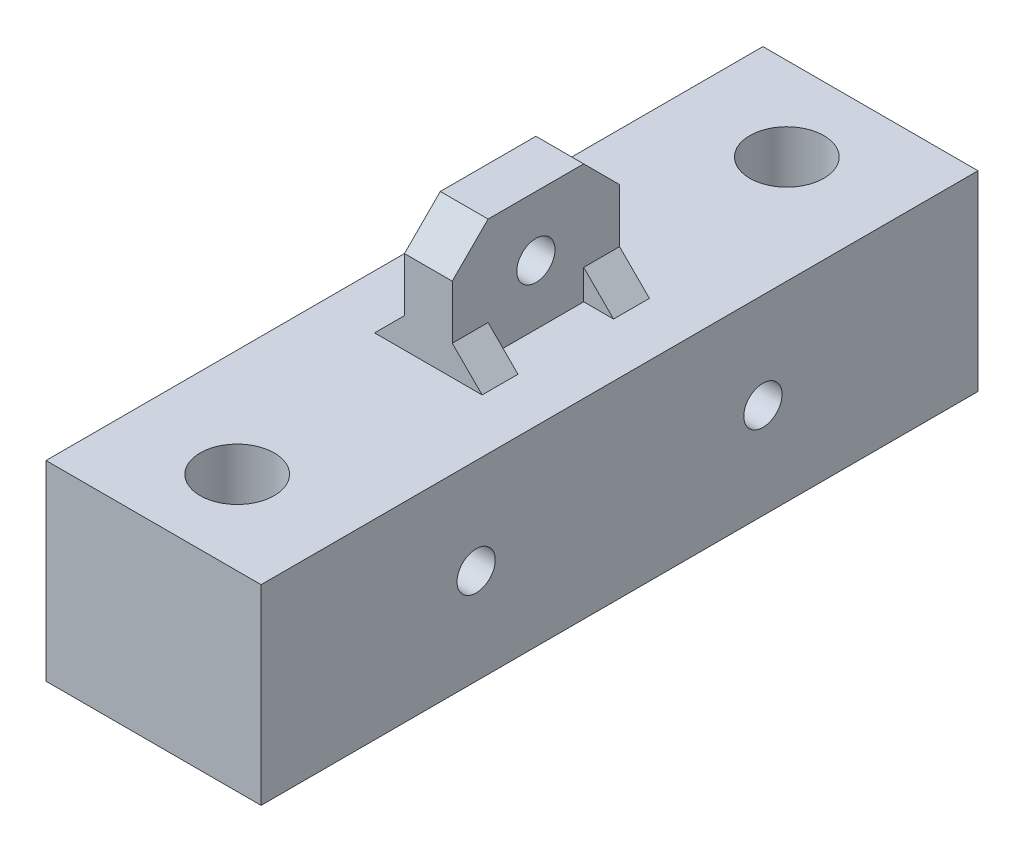
ISO-10303-21;
HEADER;
FILE_DESCRIPTION(('STEP AP214'),'2;1');
FILE_NAME('part.step','',(''),(''),'','','');
FILE_SCHEMA(('AUTOMOTIVE_DESIGN { 1 0 10303 214 1 1 1 1 }'));
ENDSEC;
DATA;
#1=APPLICATION_CONTEXT('core data for automotive mechanical design processes');
#2=APPLICATION_PROTOCOL_DEFINITION('international standard','automotive_design',2000,#1);
#3=PRODUCT_CONTEXT('',#1,'mechanical');
#4=PRODUCT('Part','Part','',(#3));
#5=PRODUCT_RELATED_PRODUCT_CATEGORY('part','',(#4));
#6=PRODUCT_DEFINITION_FORMATION('','',#4);
#7=PRODUCT_DEFINITION_CONTEXT('part definition',#1,'design');
#8=PRODUCT_DEFINITION('design','',#6,#7);
#9=PRODUCT_DEFINITION_SHAPE('','',#8);
#10=(LENGTH_UNIT() NAMED_UNIT(*) SI_UNIT(.MILLI.,.METRE.));
#11=(NAMED_UNIT(*) PLANE_ANGLE_UNIT() SI_UNIT($,.RADIAN.));
#12=(NAMED_UNIT(*) SI_UNIT($,.STERADIAN.) SOLID_ANGLE_UNIT());
#13=UNCERTAINTY_MEASURE_WITH_UNIT(LENGTH_MEASURE(1.E-05),#10,'distance_accuracy_value','');
#14=(GEOMETRIC_REPRESENTATION_CONTEXT(3) GLOBAL_UNCERTAINTY_ASSIGNED_CONTEXT((#13)) GLOBAL_UNIT_ASSIGNED_CONTEXT((#10,
#11,#12)) REPRESENTATION_CONTEXT('',''));
#15=CARTESIAN_POINT('',(0.,0.,0.));
#16=DIRECTION('',(0.,0.,1.));
#17=DIRECTION('',(1.,0.,0.));
#18=AXIS2_PLACEMENT_3D('',#15,#16,#17);
#19=CARTESIAN_POINT('',(0.,16.,0.));
#20=DIRECTION('',(0.,-1.,0.));
#21=DIRECTION('',(0.,0.,-1.));
#22=AXIS2_PLACEMENT_3D('',#19,#20,#21);
#23=PLANE('',#22);
#24=DIRECTION('',(0.,0.,-1.));
#25=VECTOR('',#24,1.);
#26=CARTESIAN_POINT('',(9.,16.,30.));
#27=LINE('',#26,#25);
#28=CARTESIAN_POINT('',(9.,16.,30.));
#29=VERTEX_POINT('',#28);
#30=CARTESIAN_POINT('',(9.,16.,-30.));
#31=VERTEX_POINT('',#30);
#32=EDGE_CURVE('E227',#29,#31,#27,.T.);
#33=ORIENTED_EDGE('',*,*,#32,.T.);
#34=DIRECTION('',(-1.,0.,0.));
#35=VECTOR('',#34,1.);
#36=CARTESIAN_POINT('',(-9.,16.,-30.));
#37=LINE('',#36,#35);
#38=CARTESIAN_POINT('',(-9.,16.,-30.));
#39=VERTEX_POINT('',#38);
#40=EDGE_CURVE('E230',#31,#39,#37,.T.);
#41=ORIENTED_EDGE('',*,*,#40,.T.);
#42=DIRECTION('',(0.,0.,1.));
#43=VECTOR('',#42,1.);
#44=CARTESIAN_POINT('',(-9.,16.,30.));
#45=LINE('',#44,#43);
#46=CARTESIAN_POINT('',(-9.,16.,30.));
#47=VERTEX_POINT('',#46);
#48=EDGE_CURVE('E233',#39,#47,#45,.T.);
#49=ORIENTED_EDGE('',*,*,#48,.T.);
#50=DIRECTION('',(1.,0.,0.));
#51=VECTOR('',#50,1.);
#52=CARTESIAN_POINT('',(-9.,16.,30.));
#53=LINE('',#52,#51);
#54=EDGE_CURVE('E235',#47,#29,#53,.T.);
#55=ORIENTED_EDGE('',*,*,#54,.T.);
#56=EDGE_LOOP('',(#33,#41,#49,#55));
#57=FACE_BOUND('',#56,.T.);
#58=CARTESIAN_POINT('',(0.,16.,23.));
#59=DIRECTION('',(0.,1.,0.));
#60=DIRECTION('',(0.,0.,1.));
#61=AXIS2_PLACEMENT_3D('',#58,#59,#60);
#62=CIRCLE('',#61,3.1);
#63=CARTESIAN_POINT('',(0.,16.,26.1));
#64=VERTEX_POINT('',#63);
#65=EDGE_CURVE('E206',#64,#64,#62,.T.);
#66=ORIENTED_EDGE('',*,*,#65,.F.);
#67=EDGE_LOOP('',(#66));
#68=FACE_BOUND('',#67,.T.);
#69=CARTESIAN_POINT('',(0.,16.,-23.));
#70=DIRECTION('',(0.,1.,0.));
#71=DIRECTION('',(0.,0.,1.));
#72=AXIS2_PLACEMENT_3D('',#69,#70,#71);
#73=CIRCLE('',#72,3.1);
#74=CARTESIAN_POINT('',(0.,16.,-19.9));
#75=VERTEX_POINT('',#74);
#76=EDGE_CURVE('E219',#75,#75,#73,.T.);
#77=ORIENTED_EDGE('',*,*,#76,.F.);
#78=EDGE_LOOP('',(#77));
#79=FACE_BOUND('',#78,.T.);
#80=DIRECTION('',(-1.,0.,0.));
#81=VECTOR('',#80,1.);
#82=CARTESIAN_POINT('',(4.5,16.,-4.));
#83=LINE('',#82,#81);
#84=CARTESIAN_POINT('',(4.5,16.,-4.));
#85=VERTEX_POINT('',#84);
#86=CARTESIAN_POINT('',(2.,16.,-4.));
#87=VERTEX_POINT('',#86);
#88=EDGE_CURVE('E165',#85,#87,#83,.T.);
#89=ORIENTED_EDGE('',*,*,#88,.T.);
#90=DIRECTION('',(0.,0.,-1.));
#91=VECTOR('',#90,1.);
#92=CARTESIAN_POINT('',(2.,16.,7.));
#93=LINE('',#92,#91);
#94=CARTESIAN_POINT('',(2.,16.,4.));
#95=VERTEX_POINT('',#94);
#96=EDGE_CURVE('E174',#95,#87,#93,.T.);
#97=ORIENTED_EDGE('',*,*,#96,.F.);
#98=DIRECTION('',(1.,0.,0.));
#99=VECTOR('',#98,1.);
#100=CARTESIAN_POINT('',(4.5,16.,4.));
#101=LINE('',#100,#99);
#102=CARTESIAN_POINT('',(4.5,16.,4.));
#103=VERTEX_POINT('',#102);
#104=EDGE_CURVE('E321',#95,#103,#101,.T.);
#105=ORIENTED_EDGE('',*,*,#104,.T.);
#106=DIRECTION('',(0.,0.,1.));
#107=VECTOR('',#106,1.);
#108=CARTESIAN_POINT('',(4.5,16.,4.));
#109=LINE('',#108,#107);
#110=CARTESIAN_POINT('',(4.5,16.,7.));
#111=VERTEX_POINT('',#110);
#112=EDGE_CURVE('E326',#103,#111,#109,.T.);
#113=ORIENTED_EDGE('',*,*,#112,.T.);
#114=DIRECTION('',(1.,0.,0.));
#115=VECTOR('',#114,1.);
#116=CARTESIAN_POINT('',(-2.,16.,7.));
#117=LINE('',#116,#115);
#118=CARTESIAN_POINT('',(-4.5,16.,7.));
#119=VERTEX_POINT('',#118);
#120=EDGE_CURVE('E183',#119,#111,#117,.T.);
#121=ORIENTED_EDGE('',*,*,#120,.F.);
#122=DIRECTION('',(0.,0.,1.));
#123=VECTOR('',#122,1.);
#124=CARTESIAN_POINT('',(-4.5,16.,4.));
#125=LINE('',#124,#123);
#126=CARTESIAN_POINT('',(-4.5,16.,4.));
#127=VERTEX_POINT('',#126);
#128=EDGE_CURVE('E343',#127,#119,#125,.T.);
#129=ORIENTED_EDGE('',*,*,#128,.F.);
#130=DIRECTION('',(1.,0.,0.));
#131=VECTOR('',#130,1.);
#132=CARTESIAN_POINT('',(-4.5,16.,4.));
#133=LINE('',#132,#131);
#134=CARTESIAN_POINT('',(-2.,16.,4.));
#135=VERTEX_POINT('',#134);
#136=EDGE_CURVE('E301',#127,#135,#133,.T.);
#137=ORIENTED_EDGE('',*,*,#136,.T.);
#138=DIRECTION('',(0.,0.,-1.));
#139=VECTOR('',#138,1.);
#140=CARTESIAN_POINT('',(-2.,16.,7.));
#141=LINE('',#140,#139);
#142=CARTESIAN_POINT('',(-2.,16.,-4.));
#143=VERTEX_POINT('',#142);
#144=EDGE_CURVE('E187',#135,#143,#141,.T.);
#145=ORIENTED_EDGE('',*,*,#144,.T.);
#146=DIRECTION('',(-1.,0.,0.));
#147=VECTOR('',#146,1.);
#148=CARTESIAN_POINT('',(-2.,16.,-4.));
#149=LINE('',#148,#147);
#150=CARTESIAN_POINT('',(-4.5,16.,-4.));
#151=VERTEX_POINT('',#150);
#152=EDGE_CURVE('E51',#143,#151,#149,.T.);
#153=ORIENTED_EDGE('',*,*,#152,.T.);
#154=DIRECTION('',(0.,0.,-1.));
#155=VECTOR('',#154,1.);
#156=CARTESIAN_POINT('',(-4.5,16.,-4.));
#157=LINE('',#156,#155);
#158=CARTESIAN_POINT('',(-4.5,16.,-7.));
#159=VERTEX_POINT('',#158);
#160=EDGE_CURVE('E312',#151,#159,#157,.T.);
#161=ORIENTED_EDGE('',*,*,#160,.T.);
#162=DIRECTION('',(1.,0.,0.));
#163=VECTOR('',#162,1.);
#164=CARTESIAN_POINT('',(-2.,16.,-7.));
#165=LINE('',#164,#163);
#166=CARTESIAN_POINT('',(4.5,16.,-7.));
#167=VERTEX_POINT('',#166);
#168=EDGE_CURVE('E59',#159,#167,#165,.T.);
#169=ORIENTED_EDGE('',*,*,#168,.T.);
#170=DIRECTION('',(0.,0.,-1.));
#171=VECTOR('',#170,1.);
#172=CARTESIAN_POINT('',(4.5,16.,-4.));
#173=LINE('',#172,#171);
#174=EDGE_CURVE('E177',#85,#167,#173,.T.);
#175=ORIENTED_EDGE('',*,*,#174,.F.);
#176=EDGE_LOOP('',(#89,#97,#105,#113,#121,#129,#137,#145,#153,#161,#169,#175));
#177=FACE_BOUND('',#176,.T.);
#178=ADVANCED_FACE('F35',(#57,#68,#79,#177),#23,.F.);
#179=CARTESIAN_POINT('',(9.,16.,30.));
#180=DIRECTION('',(-1.,0.,0.));
#181=DIRECTION('',(0.,0.,1.));
#182=AXIS2_PLACEMENT_3D('',#179,#180,#181);
#183=PLANE('',#182);
#184=CARTESIAN_POINT('',(9.,8.,-12.));
#185=DIRECTION('',(-1.,0.,0.));
#186=DIRECTION('',(0.,0.,1.));
#187=AXIS2_PLACEMENT_3D('',#184,#185,#186);
#188=CIRCLE('',#187,1.6);
#189=CARTESIAN_POINT('',(9.,8.,-10.4));
#190=VERTEX_POINT('',#189);
#191=EDGE_CURVE('E203',#190,#190,#188,.T.);
#192=ORIENTED_EDGE('',*,*,#191,.T.);
#193=EDGE_LOOP('',(#192));
#194=FACE_BOUND('',#193,.T.);
#195=CARTESIAN_POINT('',(9.,8.,12.));
#196=DIRECTION('',(-1.,0.,0.));
#197=DIRECTION('',(0.,0.,1.));
#198=AXIS2_PLACEMENT_3D('',#195,#196,#197);
#199=CIRCLE('',#198,1.6);
#200=CARTESIAN_POINT('',(9.,8.,13.6));
#201=VERTEX_POINT('',#200);
#202=EDGE_CURVE('E210',#201,#201,#199,.T.);
#203=ORIENTED_EDGE('',*,*,#202,.T.);
#204=EDGE_LOOP('',(#203));
#205=FACE_BOUND('',#204,.T.);
#206=DIRECTION('',(0.,0.,-1.));
#207=VECTOR('',#206,1.);
#208=CARTESIAN_POINT('',(9.,0.,30.));
#209=LINE('',#208,#207);
#210=CARTESIAN_POINT('',(9.,0.,30.));
#211=VERTEX_POINT('',#210);
#212=CARTESIAN_POINT('',(9.,0.,-30.));
#213=VERTEX_POINT('',#212);
#214=EDGE_CURVE('E218',#211,#213,#209,.T.);
#215=ORIENTED_EDGE('',*,*,#214,.T.);
#216=DIRECTION('',(0.,-1.,0.));
#217=VECTOR('',#216,1.);
#218=CARTESIAN_POINT('',(9.,16.,-30.));
#219=LINE('',#218,#217);
#220=EDGE_CURVE('E253',#31,#213,#219,.T.);
#221=ORIENTED_EDGE('',*,*,#220,.F.);
#222=ORIENTED_EDGE('',*,*,#32,.F.);
#223=DIRECTION('',(0.,-1.,0.));
#224=VECTOR('',#223,1.);
#225=CARTESIAN_POINT('',(9.,16.,30.));
#226=LINE('',#225,#224);
#227=EDGE_CURVE('E237',#29,#211,#226,.T.);
#228=ORIENTED_EDGE('',*,*,#227,.T.);
#229=EDGE_LOOP('',(#215,#221,#222,#228));
#230=FACE_BOUND('',#229,.T.);
#231=ADVANCED_FACE('F367',(#194,#205,#230),#183,.F.);
#232=CARTESIAN_POINT('',(-9.,16.,-30.));
#233=DIRECTION('',(0.,0.,1.));
#234=DIRECTION('',(1.,0.,0.));
#235=AXIS2_PLACEMENT_3D('',#232,#233,#234);
#236=PLANE('',#235);
#237=DIRECTION('',(-1.,0.,0.));
#238=VECTOR('',#237,1.);
#239=CARTESIAN_POINT('',(-9.,0.,-30.));
#240=LINE('',#239,#238);
#241=CARTESIAN_POINT('',(-9.,0.,-30.));
#242=VERTEX_POINT('',#241);
#243=EDGE_CURVE('E240',#213,#242,#240,.T.);
#244=ORIENTED_EDGE('',*,*,#243,.T.);
#245=DIRECTION('',(0.,-1.,0.));
#246=VECTOR('',#245,1.);
#247=CARTESIAN_POINT('',(-9.,16.,-30.));
#248=LINE('',#247,#246);
#249=EDGE_CURVE('E250',#39,#242,#248,.T.);
#250=ORIENTED_EDGE('',*,*,#249,.F.);
#251=ORIENTED_EDGE('',*,*,#40,.F.);
#252=ORIENTED_EDGE('',*,*,#220,.T.);
#253=EDGE_LOOP('',(#244,#250,#251,#252));
#254=FACE_BOUND('',#253,.T.);
#255=ADVANCED_FACE('F373',(#254),#236,.F.);
#256=CARTESIAN_POINT('',(-9.,16.,30.));
#257=DIRECTION('',(1.,0.,0.));
#258=DIRECTION('',(0.,0.,-1.));
#259=AXIS2_PLACEMENT_3D('',#256,#257,#258);
#260=PLANE('',#259);
#261=CARTESIAN_POINT('',(-9.,8.,-12.));
#262=DIRECTION('',(-1.,0.,0.));
#263=DIRECTION('',(0.,0.,1.));
#264=AXIS2_PLACEMENT_3D('',#261,#262,#263);
#265=CIRCLE('',#264,1.6);
#266=CARTESIAN_POINT('',(-9.,8.,-10.4));
#267=VERTEX_POINT('',#266);
#268=EDGE_CURVE('E207',#267,#267,#265,.T.);
#269=ORIENTED_EDGE('',*,*,#268,.F.);
#270=EDGE_LOOP('',(#269));
#271=FACE_BOUND('',#270,.T.);
#272=CARTESIAN_POINT('',(-9.,8.,12.));
#273=DIRECTION('',(-1.,0.,0.));
#274=DIRECTION('',(0.,0.,1.));
#275=AXIS2_PLACEMENT_3D('',#272,#273,#274);
#276=CIRCLE('',#275,1.6);
#277=CARTESIAN_POINT('',(-9.,8.,13.6));
#278=VERTEX_POINT('',#277);
#279=EDGE_CURVE('E194',#278,#278,#276,.T.);
#280=ORIENTED_EDGE('',*,*,#279,.F.);
#281=EDGE_LOOP('',(#280));
#282=FACE_BOUND('',#281,.T.);
#283=DIRECTION('',(0.,0.,1.));
#284=VECTOR('',#283,1.);
#285=CARTESIAN_POINT('',(-9.,0.,30.));
#286=LINE('',#285,#284);
#287=CARTESIAN_POINT('',(-9.,0.,30.));
#288=VERTEX_POINT('',#287);
#289=EDGE_CURVE('E242',#242,#288,#286,.T.);
#290=ORIENTED_EDGE('',*,*,#289,.T.);
#291=DIRECTION('',(0.,-1.,0.));
#292=VECTOR('',#291,1.);
#293=CARTESIAN_POINT('',(-9.,16.,30.));
#294=LINE('',#293,#292);
#295=EDGE_CURVE('E247',#47,#288,#294,.T.);
#296=ORIENTED_EDGE('',*,*,#295,.F.);
#297=ORIENTED_EDGE('',*,*,#48,.F.);
#298=ORIENTED_EDGE('',*,*,#249,.T.);
#299=EDGE_LOOP('',(#290,#296,#297,#298));
#300=FACE_BOUND('',#299,.T.);
#301=ADVANCED_FACE('F388',(#271,#282,#300),#260,.F.);
#302=CARTESIAN_POINT('',(-9.,16.,30.));
#303=DIRECTION('',(0.,0.,-1.));
#304=DIRECTION('',(-1.,0.,0.));
#305=AXIS2_PLACEMENT_3D('',#302,#303,#304);
#306=PLANE('',#305);
#307=DIRECTION('',(1.,0.,0.));
#308=VECTOR('',#307,1.);
#309=CARTESIAN_POINT('',(-9.,0.,30.));
#310=LINE('',#309,#308);
#311=EDGE_CURVE('E231',#288,#211,#310,.T.);
#312=ORIENTED_EDGE('',*,*,#311,.T.);
#313=ORIENTED_EDGE('',*,*,#227,.F.);
#314=ORIENTED_EDGE('',*,*,#54,.F.);
#315=ORIENTED_EDGE('',*,*,#295,.T.);
#316=EDGE_LOOP('',(#312,#313,#314,#315));
#317=FACE_BOUND('',#316,.T.);
#318=ADVANCED_FACE('F384',(#317),#306,.F.);
#319=CARTESIAN_POINT('',(0.,0.,0.));
#320=DIRECTION('',(0.,-1.,0.));
#321=DIRECTION('',(0.,0.,-1.));
#322=AXIS2_PLACEMENT_3D('',#319,#320,#321);
#323=PLANE('',#322);
#324=CARTESIAN_POINT('',(0.,0.,-23.));
#325=DIRECTION('',(0.,1.,0.));
#326=DIRECTION('',(0.,0.,1.));
#327=AXIS2_PLACEMENT_3D('',#324,#325,#326);
#328=CIRCLE('',#327,3.1);
#329=CARTESIAN_POINT('',(0.,0.,-19.9));
#330=VERTEX_POINT('',#329);
#331=EDGE_CURVE('E215',#330,#330,#328,.T.);
#332=ORIENTED_EDGE('',*,*,#331,.T.);
#333=EDGE_LOOP('',(#332));
#334=FACE_BOUND('',#333,.T.);
#335=CARTESIAN_POINT('',(0.,0.,23.));
#336=DIRECTION('',(0.,1.,0.));
#337=DIRECTION('',(0.,0.,1.));
#338=AXIS2_PLACEMENT_3D('',#335,#336,#337);
#339=CIRCLE('',#338,3.1);
#340=CARTESIAN_POINT('',(0.,0.,26.1));
#341=VERTEX_POINT('',#340);
#342=EDGE_CURVE('E222',#341,#341,#339,.T.);
#343=ORIENTED_EDGE('',*,*,#342,.T.);
#344=EDGE_LOOP('',(#343));
#345=FACE_BOUND('',#344,.T.);
#346=ORIENTED_EDGE('',*,*,#214,.F.);
#347=ORIENTED_EDGE('',*,*,#311,.F.);
#348=ORIENTED_EDGE('',*,*,#289,.F.);
#349=ORIENTED_EDGE('',*,*,#243,.F.);
#350=EDGE_LOOP('',(#346,#347,#348,#349));
#351=FACE_BOUND('',#350,.T.);
#352=ADVANCED_FACE('F381',(#334,#345,#351),#323,.T.);
#353=CARTESIAN_POINT('',(0.,0.,23.));
#354=DIRECTION('',(0.,1.,0.));
#355=DIRECTION('',(0.,0.,1.));
#356=AXIS2_PLACEMENT_3D('',#353,#354,#355);
#357=CYLINDRICAL_SURFACE('',#356,3.1);
#358=ORIENTED_EDGE('',*,*,#342,.F.);
#359=EDGE_LOOP('',(#358));
#360=FACE_BOUND('',#359,.T.);
#361=ORIENTED_EDGE('',*,*,#65,.T.);
#362=EDGE_LOOP('',(#361));
#363=FACE_BOUND('',#362,.T.);
#364=ADVANCED_FACE('F379',(#360,#363),#357,.F.);
#365=CARTESIAN_POINT('',(0.,0.,-23.));
#366=DIRECTION('',(0.,1.,0.));
#367=DIRECTION('',(0.,0.,1.));
#368=AXIS2_PLACEMENT_3D('',#365,#366,#367);
#369=CYLINDRICAL_SURFACE('',#368,3.1);
#370=ORIENTED_EDGE('',*,*,#331,.F.);
#371=EDGE_LOOP('',(#370));
#372=FACE_BOUND('',#371,.T.);
#373=ORIENTED_EDGE('',*,*,#76,.T.);
#374=EDGE_LOOP('',(#373));
#375=FACE_BOUND('',#374,.T.);
#376=ADVANCED_FACE('F561',(#372,#375),#369,.F.);
#377=CARTESIAN_POINT('',(9.,8.,12.));
#378=DIRECTION('',(-1.,0.,0.));
#379=DIRECTION('',(0.,0.,1.));
#380=AXIS2_PLACEMENT_3D('',#377,#378,#379);
#381=CYLINDRICAL_SURFACE('',#380,1.6);
#382=ORIENTED_EDGE('',*,*,#202,.F.);
#383=EDGE_LOOP('',(#382));
#384=FACE_BOUND('',#383,.T.);
#385=ORIENTED_EDGE('',*,*,#279,.T.);
#386=EDGE_LOOP('',(#385));
#387=FACE_BOUND('',#386,.T.);
#388=ADVANCED_FACE('F362',(#384,#387),#381,.F.);
#389=CARTESIAN_POINT('',(9.,8.,-12.));
#390=DIRECTION('',(-1.,0.,0.));
#391=DIRECTION('',(0.,0.,1.));
#392=AXIS2_PLACEMENT_3D('',#389,#390,#391);
#393=CYLINDRICAL_SURFACE('',#392,1.6);
#394=ORIENTED_EDGE('',*,*,#191,.F.);
#395=EDGE_LOOP('',(#394));
#396=FACE_BOUND('',#395,.T.);
#397=ORIENTED_EDGE('',*,*,#268,.T.);
#398=EDGE_LOOP('',(#397));
#399=FACE_BOUND('',#398,.T.);
#400=ADVANCED_FACE('F354',(#396,#399),#393,.F.);
#401=CARTESIAN_POINT('',(-2.,26.,7.));
#402=DIRECTION('',(-1.,0.,0.));
#403=DIRECTION('',(0.,0.,1.));
#404=AXIS2_PLACEMENT_3D('',#401,#402,#403);
#405=PLANE('',#404);
#406=DIRECTION('',(0.,0.,-1.));
#407=VECTOR('',#406,1.);
#408=CARTESIAN_POINT('',(-2.,18.5,-4.));
#409=LINE('',#408,#407);
#410=CARTESIAN_POINT('',(-2.,18.5,-4.));
#411=VERTEX_POINT('',#410);
#412=CARTESIAN_POINT('',(-2.,18.5,-7.));
#413=VERTEX_POINT('',#412);
#414=EDGE_CURVE('E310',#411,#413,#409,.T.);
#415=ORIENTED_EDGE('',*,*,#414,.F.);
#416=DIRECTION('',(0.,-1.,0.));
#417=VECTOR('',#416,1.);
#418=CARTESIAN_POINT('',(-2.,18.5,-4.));
#419=LINE('',#418,#417);
#420=EDGE_CURVE('E307',#411,#143,#419,.T.);
#421=ORIENTED_EDGE('',*,*,#420,.T.);
#422=ORIENTED_EDGE('',*,*,#144,.F.);
#423=DIRECTION('',(0.,1.,0.));
#424=VECTOR('',#423,1.);
#425=CARTESIAN_POINT('',(-2.,16.,4.));
#426=LINE('',#425,#424);
#427=CARTESIAN_POINT('',(-2.,18.5,4.));
#428=VERTEX_POINT('',#427);
#429=EDGE_CURVE('E335',#135,#428,#426,.T.);
#430=ORIENTED_EDGE('',*,*,#429,.T.);
#431=DIRECTION('',(0.,0.,1.));
#432=VECTOR('',#431,1.);
#433=CARTESIAN_POINT('',(-2.,18.5,4.));
#434=LINE('',#433,#432);
#435=CARTESIAN_POINT('',(-2.,18.5,7.));
#436=VERTEX_POINT('',#435);
#437=EDGE_CURVE('E340',#428,#436,#434,.T.);
#438=ORIENTED_EDGE('',*,*,#437,.T.);
#439=DIRECTION('',(0.,-1.,0.));
#440=VECTOR('',#439,1.);
#441=CARTESIAN_POINT('',(-2.,26.,7.));
#442=LINE('',#441,#440);
#443=CARTESIAN_POINT('',(-2.,23.,7.));
#444=VERTEX_POINT('',#443);
#445=EDGE_CURVE('E191',#444,#436,#442,.T.);
#446=ORIENTED_EDGE('',*,*,#445,.F.);
#447=DIRECTION('',(0.,-0.707106781186549,0.707106781186546));
#448=VECTOR('',#447,1.);
#449=CARTESIAN_POINT('',(-2.,24.5,5.49999999999999));
#450=LINE('',#449,#448);
#451=CARTESIAN_POINT('',(-2.,26.,4.));
#452=VERTEX_POINT('',#451);
#453=EDGE_CURVE('E272',#444,#452,#450,.F.);
#454=ORIENTED_EDGE('',*,*,#453,.T.);
#455=DIRECTION('',(0.,0.,-1.));
#456=VECTOR('',#455,1.);
#457=CARTESIAN_POINT('',(-2.,26.,7.));
#458=LINE('',#457,#456);
#459=CARTESIAN_POINT('',(-2.,26.,-3.99999999999998));
#460=VERTEX_POINT('',#459);
#461=EDGE_CURVE('E185',#452,#460,#458,.T.);
#462=ORIENTED_EDGE('',*,*,#461,.T.);
#463=DIRECTION('',(0.,-0.707106781186546,-0.707106781186549));
#464=VECTOR('',#463,1.);
#465=CARTESIAN_POINT('',(-2.,31.5,1.50000000000004));
#466=LINE('',#465,#464);
#467=CARTESIAN_POINT('',(-2.,23.,-7.));
#468=VERTEX_POINT('',#467);
#469=EDGE_CURVE('E44',#460,#468,#466,.T.);
#470=ORIENTED_EDGE('',*,*,#469,.T.);
#471=DIRECTION('',(0.,-1.,0.));
#472=VECTOR('',#471,1.);
#473=CARTESIAN_POINT('',(-2.,26.,-7.));
#474=LINE('',#473,#472);
#475=EDGE_CURVE('E200',#468,#413,#474,.T.);
#476=ORIENTED_EDGE('',*,*,#475,.T.);
#477=EDGE_LOOP('',(#415,#421,#422,#430,#438,#446,#454,#462,#470,#476));
#478=FACE_BOUND('',#477,.T.);
#479=CARTESIAN_POINT('',(-2.,21.,0.));
#480=DIRECTION('',(-1.,0.,0.));
#481=DIRECTION('',(0.,0.,1.));
#482=AXIS2_PLACEMENT_3D('',#479,#480,#481);
#483=CIRCLE('',#482,1.6);
#484=CARTESIAN_POINT('',(-2.,21.,1.6));
#485=VERTEX_POINT('',#484);
#486=EDGE_CURVE('E260',#485,#485,#483,.T.);
#487=ORIENTED_EDGE('',*,*,#486,.F.);
#488=EDGE_LOOP('',(#487));
#489=FACE_BOUND('',#488,.T.);
#490=ADVANCED_FACE('F277',(#478,#489),#405,.T.);
#491=CARTESIAN_POINT('',(-2.,26.,7.));
#492=DIRECTION('',(0.,0.,-1.));
#493=DIRECTION('',(-1.,0.,0.));
#494=AXIS2_PLACEMENT_3D('',#491,#492,#493);
#495=PLANE('',#494);
#496=DIRECTION('',(0.,-1.,0.));
#497=VECTOR('',#496,1.);
#498=CARTESIAN_POINT('',(2.,26.,7.));
#499=LINE('',#498,#497);
#500=CARTESIAN_POINT('',(2.,23.,7.));
#501=VERTEX_POINT('',#500);
#502=CARTESIAN_POINT('',(2.,18.5,7.));
#503=VERTEX_POINT('',#502);
#504=EDGE_CURVE('E195',#501,#503,#499,.T.);
#505=ORIENTED_EDGE('',*,*,#504,.F.);
#506=DIRECTION('',(-1.,0.,0.));
#507=VECTOR('',#506,1.);
#508=CARTESIAN_POINT('',(-2.,23.,7.));
#509=LINE('',#508,#507);
#510=EDGE_CURVE('E11',#501,#444,#509,.T.);
#511=ORIENTED_EDGE('',*,*,#510,.T.);
#512=ORIENTED_EDGE('',*,*,#445,.T.);
#513=DIRECTION('',(-0.707106781186548,-0.707106781186547,0.));
#514=VECTOR('',#513,1.);
#515=CARTESIAN_POINT('',(-2.,18.5,7.));
#516=LINE('',#515,#514);
#517=EDGE_CURVE('E332',#436,#119,#516,.T.);
#518=ORIENTED_EDGE('',*,*,#517,.T.);
#519=ORIENTED_EDGE('',*,*,#120,.T.);
#520=DIRECTION('',(-0.707106781186547,0.707106781186548,0.));
#521=VECTOR('',#520,1.);
#522=CARTESIAN_POINT('',(2.,18.5,7.));
#523=LINE('',#522,#521);
#524=EDGE_CURVE('E318',#111,#503,#523,.T.);
#525=ORIENTED_EDGE('',*,*,#524,.T.);
#526=EDGE_LOOP('',(#505,#511,#512,#518,#519,#525));
#527=FACE_BOUND('',#526,.T.);
#528=ADVANCED_FACE('F353',(#527),#495,.F.);
#529=CARTESIAN_POINT('',(2.,26.,7.));
#530=DIRECTION('',(-1.,0.,0.));
#531=DIRECTION('',(0.,0.,1.));
#532=AXIS2_PLACEMENT_3D('',#529,#530,#531);
#533=PLANE('',#532);
#534=CARTESIAN_POINT('',(2.,21.,0.));
#535=DIRECTION('',(-1.,0.,0.));
#536=DIRECTION('',(0.,0.,1.));
#537=AXIS2_PLACEMENT_3D('',#534,#535,#536);
#538=CIRCLE('',#537,1.6);
#539=CARTESIAN_POINT('',(2.,21.,1.6));
#540=VERTEX_POINT('',#539);
#541=EDGE_CURVE('E257',#540,#540,#538,.T.);
#542=ORIENTED_EDGE('',*,*,#541,.T.);
#543=EDGE_LOOP('',(#542));
#544=FACE_BOUND('',#543,.T.);
#545=DIRECTION('',(0.,1.,0.));
#546=VECTOR('',#545,1.);
#547=CARTESIAN_POINT('',(2.,16.,-4.));
#548=LINE('',#547,#546);
#549=CARTESIAN_POINT('',(2.,18.5,-4.));
#550=VERTEX_POINT('',#549);
#551=EDGE_CURVE('E162',#87,#550,#548,.T.);
#552=ORIENTED_EDGE('',*,*,#551,.T.);
#553=DIRECTION('',(0.,0.,-1.));
#554=VECTOR('',#553,1.);
#555=CARTESIAN_POINT('',(2.,18.5,-4.));
#556=LINE('',#555,#554);
#557=CARTESIAN_POINT('',(2.,18.5,-7.));
#558=VERTEX_POINT('',#557);
#559=EDGE_CURVE('E545',#550,#558,#556,.T.);
#560=ORIENTED_EDGE('',*,*,#559,.T.);
#561=DIRECTION('',(0.,-1.,0.));
#562=VECTOR('',#561,1.);
#563=CARTESIAN_POINT('',(2.,26.,-7.));
#564=LINE('',#563,#562);
#565=CARTESIAN_POINT('',(2.,23.,-7.));
#566=VERTEX_POINT('',#565);
#567=EDGE_CURVE('E197',#566,#558,#564,.T.);
#568=ORIENTED_EDGE('',*,*,#567,.F.);
#569=DIRECTION('',(0.,0.707106781186546,0.707106781186549));
#570=VECTOR('',#569,1.);
#571=CARTESIAN_POINT('',(2.,23.,-7.));
#572=LINE('',#571,#570);
#573=CARTESIAN_POINT('',(2.,26.,-3.99999999999998));
#574=VERTEX_POINT('',#573);
#575=EDGE_CURVE('E265',#566,#574,#572,.T.);
#576=ORIENTED_EDGE('',*,*,#575,.T.);
#577=DIRECTION('',(0.,0.,-1.));
#578=VECTOR('',#577,1.);
#579=CARTESIAN_POINT('',(2.,26.,7.));
#580=LINE('',#579,#578);
#581=CARTESIAN_POINT('',(2.,26.,4.));
#582=VERTEX_POINT('',#581);
#583=EDGE_CURVE('E202',#582,#574,#580,.T.);
#584=ORIENTED_EDGE('',*,*,#583,.F.);
#585=DIRECTION('',(0.,0.707106781186549,-0.707106781186546));
#586=VECTOR('',#585,1.);
#587=CARTESIAN_POINT('',(2.,26.,4.));
#588=LINE('',#587,#586);
#589=EDGE_CURVE('E263',#582,#501,#588,.F.);
#590=ORIENTED_EDGE('',*,*,#589,.T.);
#591=ORIENTED_EDGE('',*,*,#504,.T.);
#592=DIRECTION('',(0.,0.,1.));
#593=VECTOR('',#592,1.);
#594=CARTESIAN_POINT('',(2.,18.5,4.));
#595=LINE('',#594,#593);
#596=CARTESIAN_POINT('',(2.,18.5,4.));
#597=VERTEX_POINT('',#596);
#598=EDGE_CURVE('E329',#597,#503,#595,.T.);
#599=ORIENTED_EDGE('',*,*,#598,.F.);
#600=DIRECTION('',(0.,-1.,0.));
#601=VECTOR('',#600,1.);
#602=CARTESIAN_POINT('',(2.,16.,4.));
#603=LINE('',#602,#601);
#604=EDGE_CURVE('E182',#597,#95,#603,.T.);
#605=ORIENTED_EDGE('',*,*,#604,.T.);
#606=ORIENTED_EDGE('',*,*,#96,.T.);
#607=EDGE_LOOP('',(#552,#560,#568,#576,#584,#590,#591,#599,#605,#606));
#608=FACE_BOUND('',#607,.T.);
#609=ADVANCED_FACE('F180',(#544,#608),#533,.F.);
#610=CARTESIAN_POINT('',(-2.,26.,-7.));
#611=DIRECTION('',(0.,0.,-1.));
#612=DIRECTION('',(-1.,0.,0.));
#613=AXIS2_PLACEMENT_3D('',#610,#611,#612);
#614=PLANE('',#613);
#615=ORIENTED_EDGE('',*,*,#475,.F.);
#616=DIRECTION('',(1.,0.,0.));
#617=VECTOR('',#616,1.);
#618=CARTESIAN_POINT('',(2.,23.,-7.));
#619=LINE('',#618,#617);
#620=EDGE_CURVE('E256',#468,#566,#619,.T.);
#621=ORIENTED_EDGE('',*,*,#620,.T.);
#622=ORIENTED_EDGE('',*,*,#567,.T.);
#623=DIRECTION('',(0.707106781186547,-0.707106781186548,0.));
#624=VECTOR('',#623,1.);
#625=CARTESIAN_POINT('',(2.,18.5,-7.));
#626=LINE('',#625,#624);
#627=EDGE_CURVE('E178',#558,#167,#626,.T.);
#628=ORIENTED_EDGE('',*,*,#627,.T.);
#629=ORIENTED_EDGE('',*,*,#168,.F.);
#630=DIRECTION('',(0.707106781186548,0.707106781186547,0.));
#631=VECTOR('',#630,1.);
#632=CARTESIAN_POINT('',(-4.5,16.,-7.));
#633=LINE('',#632,#631);
#634=EDGE_CURVE('E287',#159,#413,#633,.T.);
#635=ORIENTED_EDGE('',*,*,#634,.T.);
#636=EDGE_LOOP('',(#615,#621,#622,#628,#629,#635));
#637=FACE_BOUND('',#636,.T.);
#638=ADVANCED_FACE('F284',(#637),#614,.T.);
#639=CARTESIAN_POINT('',(0.,26.,0.));
#640=DIRECTION('',(0.,-1.,0.));
#641=DIRECTION('',(0.,0.,-1.));
#642=AXIS2_PLACEMENT_3D('',#639,#640,#641);
#643=PLANE('',#642);
#644=ORIENTED_EDGE('',*,*,#583,.T.);
#645=DIRECTION('',(-1.,0.,0.));
#646=VECTOR('',#645,1.);
#647=CARTESIAN_POINT('',(-2.,26.,-3.99999999999998));
#648=LINE('',#647,#646);
#649=EDGE_CURVE('E270',#574,#460,#648,.T.);
#650=ORIENTED_EDGE('',*,*,#649,.T.);
#651=ORIENTED_EDGE('',*,*,#461,.F.);
#652=DIRECTION('',(1.,0.,0.));
#653=VECTOR('',#652,1.);
#654=CARTESIAN_POINT('',(0.,26.,4.));
#655=LINE('',#654,#653);
#656=EDGE_CURVE('E267',#452,#582,#655,.T.);
#657=ORIENTED_EDGE('',*,*,#656,.T.);
#658=EDGE_LOOP('',(#644,#650,#651,#657));
#659=FACE_BOUND('',#658,.T.);
#660=ADVANCED_FACE('F292',(#659),#643,.F.);
#661=CARTESIAN_POINT('',(9.,21.,0.));
#662=DIRECTION('',(-1.,0.,0.));
#663=DIRECTION('',(0.,0.,1.));
#664=AXIS2_PLACEMENT_3D('',#661,#662,#663);
#665=CYLINDRICAL_SURFACE('',#664,1.6);
#666=ORIENTED_EDGE('',*,*,#486,.T.);
#667=EDGE_LOOP('',(#666));
#668=FACE_BOUND('',#667,.T.);
#669=ORIENTED_EDGE('',*,*,#541,.F.);
#670=EDGE_LOOP('',(#669));
#671=FACE_BOUND('',#670,.T.);
#672=ADVANCED_FACE('F350',(#668,#671),#665,.F.);
#673=CARTESIAN_POINT('',(-2.,23.,-7.));
#674=DIRECTION('',(0.,0.707106781186549,-0.707106781186546));
#675=DIRECTION('',(-1.,0.,0.));
#676=AXIS2_PLACEMENT_3D('',#673,#674,#675);
#677=PLANE('',#676);
#678=ORIENTED_EDGE('',*,*,#469,.F.);
#679=ORIENTED_EDGE('',*,*,#649,.F.);
#680=ORIENTED_EDGE('',*,*,#575,.F.);
#681=ORIENTED_EDGE('',*,*,#620,.F.);
#682=EDGE_LOOP('',(#678,#679,#680,#681));
#683=FACE_BOUND('',#682,.T.);
#684=ADVANCED_FACE('F288',(#683),#677,.T.);
#685=CARTESIAN_POINT('',(0.,26.,4.));
#686=DIRECTION('',(0.,-0.707106781186546,-0.707106781186549));
#687=DIRECTION('',(1.,0.,0.));
#688=AXIS2_PLACEMENT_3D('',#685,#686,#687);
#689=PLANE('',#688);
#690=ORIENTED_EDGE('',*,*,#453,.F.);
#691=ORIENTED_EDGE('',*,*,#510,.F.);
#692=ORIENTED_EDGE('',*,*,#589,.F.);
#693=ORIENTED_EDGE('',*,*,#656,.F.);
#694=EDGE_LOOP('',(#690,#691,#692,#693));
#695=FACE_BOUND('',#694,.T.);
#696=ADVANCED_FACE('F38',(#695),#689,.F.);
#697=CARTESIAN_POINT('',(-2.,18.5,4.));
#698=DIRECTION('',(-0.707106781186547,0.707106781186548,0.));
#699=DIRECTION('',(-0.707106781186548,-0.707106781186547,0.));
#700=AXIS2_PLACEMENT_3D('',#697,#698,#699);
#701=PLANE('',#700);
#702=ORIENTED_EDGE('',*,*,#517,.F.);
#703=ORIENTED_EDGE('',*,*,#437,.F.);
#704=DIRECTION('',(-0.707106781186548,-0.707106781186547,0.));
#705=VECTOR('',#704,1.);
#706=CARTESIAN_POINT('',(-2.,18.5,4.));
#707=LINE('',#706,#705);
#708=EDGE_CURVE('E337',#428,#127,#707,.T.);
#709=ORIENTED_EDGE('',*,*,#708,.T.);
#710=ORIENTED_EDGE('',*,*,#128,.T.);
#711=EDGE_LOOP('',(#702,#703,#709,#710));
#712=FACE_BOUND('',#711,.T.);
#713=ADVANCED_FACE('F403',(#712),#701,.T.);
#714=CARTESIAN_POINT('',(0.,0.,4.));
#715=DIRECTION('',(0.,0.,-1.));
#716=DIRECTION('',(-1.,0.,0.));
#717=AXIS2_PLACEMENT_3D('',#714,#715,#716);
#718=PLANE('',#717);
#719=ORIENTED_EDGE('',*,*,#429,.F.);
#720=ORIENTED_EDGE('',*,*,#136,.F.);
#721=ORIENTED_EDGE('',*,*,#708,.F.);
#722=EDGE_LOOP('',(#719,#720,#721));
#723=FACE_BOUND('',#722,.T.);
#724=ADVANCED_FACE('F455',(#723),#718,.T.);
#725=CARTESIAN_POINT('',(2.,18.5,4.));
#726=DIRECTION('',(0.707106781186548,0.707106781186547,0.));
#727=DIRECTION('',(-0.707106781186547,0.707106781186548,0.));
#728=AXIS2_PLACEMENT_3D('',#725,#726,#727);
#729=PLANE('',#728);
#730=ORIENTED_EDGE('',*,*,#524,.F.);
#731=ORIENTED_EDGE('',*,*,#112,.F.);
#732=DIRECTION('',(-0.707106781186547,0.707106781186548,0.));
#733=VECTOR('',#732,1.);
#734=CARTESIAN_POINT('',(2.,18.5,4.));
#735=LINE('',#734,#733);
#736=EDGE_CURVE('E323',#103,#597,#735,.T.);
#737=ORIENTED_EDGE('',*,*,#736,.T.);
#738=ORIENTED_EDGE('',*,*,#598,.T.);
#739=EDGE_LOOP('',(#730,#731,#737,#738));
#740=FACE_BOUND('',#739,.T.);
#741=ADVANCED_FACE('F464',(#740),#729,.T.);
#742=CARTESIAN_POINT('',(0.,0.,4.));
#743=DIRECTION('',(0.,0.,1.));
#744=DIRECTION('',(1.,0.,0.));
#745=AXIS2_PLACEMENT_3D('',#742,#743,#744);
#746=PLANE('',#745);
#747=ORIENTED_EDGE('',*,*,#604,.F.);
#748=ORIENTED_EDGE('',*,*,#736,.F.);
#749=ORIENTED_EDGE('',*,*,#104,.F.);
#750=EDGE_LOOP('',(#747,#748,#749));
#751=FACE_BOUND('',#750,.T.);
#752=ADVANCED_FACE('F473',(#751),#746,.F.);
#753=CARTESIAN_POINT('',(-4.5,16.,-4.));
#754=DIRECTION('',(-0.707106781186547,0.707106781186548,0.));
#755=DIRECTION('',(-0.707106781186548,-0.707106781186547,0.));
#756=AXIS2_PLACEMENT_3D('',#753,#754,#755);
#757=PLANE('',#756);
#758=ORIENTED_EDGE('',*,*,#634,.F.);
#759=ORIENTED_EDGE('',*,*,#160,.F.);
#760=DIRECTION('',(0.707106781186548,0.707106781186547,0.));
#761=VECTOR('',#760,1.);
#762=CARTESIAN_POINT('',(-4.5,16.,-4.));
#763=LINE('',#762,#761);
#764=EDGE_CURVE('E309',#151,#411,#763,.T.);
#765=ORIENTED_EDGE('',*,*,#764,.T.);
#766=ORIENTED_EDGE('',*,*,#414,.T.);
#767=EDGE_LOOP('',(#758,#759,#765,#766));
#768=FACE_BOUND('',#767,.T.);
#769=ADVANCED_FACE('F482',(#768),#757,.T.);
#770=CARTESIAN_POINT('',(0.,0.,-4.));
#771=DIRECTION('',(0.,0.,-1.));
#772=DIRECTION('',(-1.,0.,0.));
#773=AXIS2_PLACEMENT_3D('',#770,#771,#772);
#774=PLANE('',#773);
#775=ORIENTED_EDGE('',*,*,#764,.F.);
#776=ORIENTED_EDGE('',*,*,#152,.F.);
#777=ORIENTED_EDGE('',*,*,#420,.F.);
#778=EDGE_LOOP('',(#775,#776,#777));
#779=FACE_BOUND('',#778,.T.);
#780=ADVANCED_FACE('F306',(#779),#774,.F.);
#781=CARTESIAN_POINT('',(2.,18.5,-4.));
#782=DIRECTION('',(0.707106781186548,0.707106781186547,0.));
#783=DIRECTION('',(-0.707106781186547,0.707106781186548,0.));
#784=AXIS2_PLACEMENT_3D('',#781,#782,#783);
#785=PLANE('',#784);
#786=ORIENTED_EDGE('',*,*,#627,.F.);
#787=ORIENTED_EDGE('',*,*,#559,.F.);
#788=DIRECTION('',(0.707106781186547,-0.707106781186548,0.));
#789=VECTOR('',#788,1.);
#790=CARTESIAN_POINT('',(2.,18.5,-4.));
#791=LINE('',#790,#789);
#792=EDGE_CURVE('E167',#550,#85,#791,.T.);
#793=ORIENTED_EDGE('',*,*,#792,.T.);
#794=ORIENTED_EDGE('',*,*,#174,.T.);
#795=EDGE_LOOP('',(#786,#787,#793,#794));
#796=FACE_BOUND('',#795,.T.);
#797=ADVANCED_FACE('F524',(#796),#785,.T.);
#798=CARTESIAN_POINT('',(0.,0.,-4.));
#799=DIRECTION('',(0.,0.,-1.));
#800=DIRECTION('',(-1.,0.,0.));
#801=AXIS2_PLACEMENT_3D('',#798,#799,#800);
#802=PLANE('',#801);
#803=ORIENTED_EDGE('',*,*,#88,.F.);
#804=ORIENTED_EDGE('',*,*,#792,.F.);
#805=ORIENTED_EDGE('',*,*,#551,.F.);
#806=EDGE_LOOP('',(#803,#804,#805));
#807=FACE_BOUND('',#806,.T.);
#808=ADVANCED_FACE('F164',(#807),#802,.F.);
#809=CLOSED_SHELL('',(#178,#231,#255,#301,#318,#352,#364,#376,#388,#400,#490,#528,#609,#638,
#660,#672,#684,#696,#713,#724,#741,#752,#769,#780,#797,#808));
#810=MANIFOLD_SOLID_BREP('B2',#809);
#811=ADVANCED_BREP_SHAPE_REPRESENTATION('',(#18,#810),#14);
#812=SHAPE_DEFINITION_REPRESENTATION(#9,#811);
ENDSEC;
END-ISO-10303-21;
